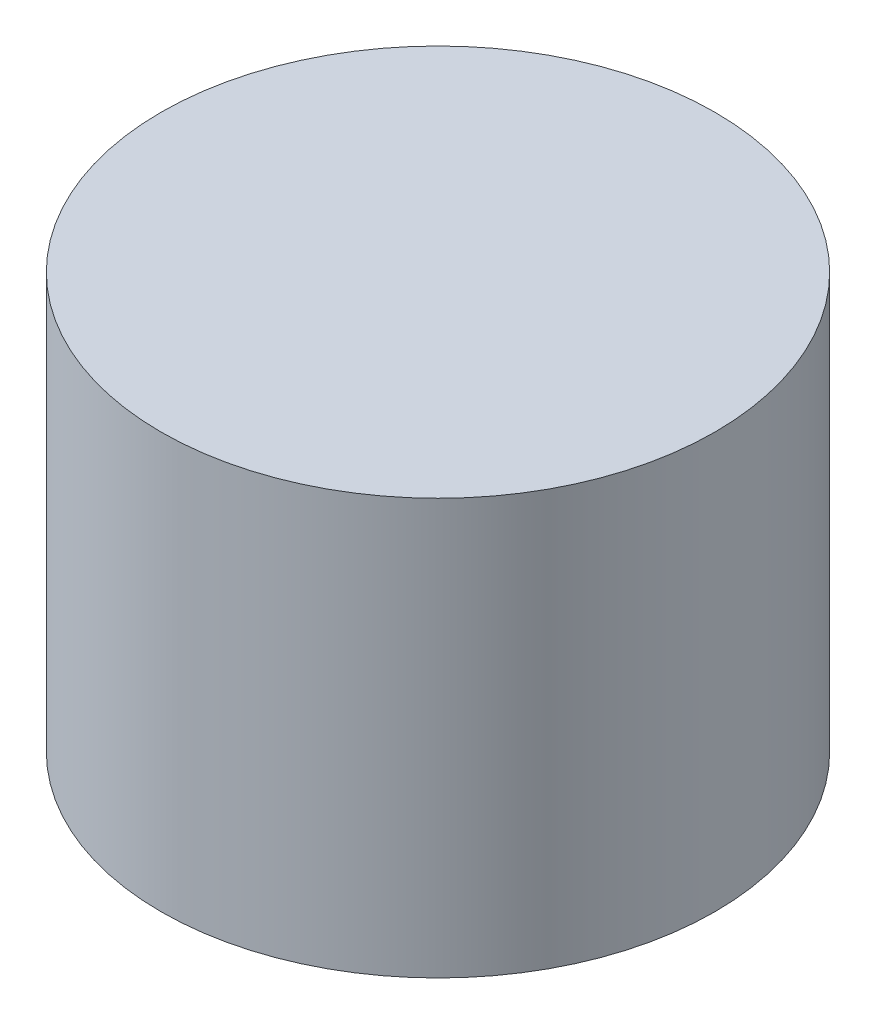
ISO-10303-21;
HEADER;
FILE_DESCRIPTION(('STEP AP214'),'2;1');
FILE_NAME('part.step','',(''),(''),'','','');
FILE_SCHEMA(('AUTOMOTIVE_DESIGN { 1 0 10303 214 1 1 1 1 }'));
ENDSEC;
DATA;
#1=APPLICATION_CONTEXT('core data for automotive mechanical design processes');
#2=APPLICATION_PROTOCOL_DEFINITION('international standard','automotive_design',2000,#1);
#3=PRODUCT_CONTEXT('',#1,'mechanical');
#4=PRODUCT('Part','Part','',(#3));
#5=PRODUCT_RELATED_PRODUCT_CATEGORY('part','',(#4));
#6=PRODUCT_DEFINITION_FORMATION('','',#4);
#7=PRODUCT_DEFINITION_CONTEXT('part definition',#1,'design');
#8=PRODUCT_DEFINITION('design','',#6,#7);
#9=PRODUCT_DEFINITION_SHAPE('','',#8);
#10=(LENGTH_UNIT() NAMED_UNIT(*) SI_UNIT(.MILLI.,.METRE.));
#11=(NAMED_UNIT(*) PLANE_ANGLE_UNIT() SI_UNIT($,.RADIAN.));
#12=(NAMED_UNIT(*) SI_UNIT($,.STERADIAN.) SOLID_ANGLE_UNIT());
#13=UNCERTAINTY_MEASURE_WITH_UNIT(LENGTH_MEASURE(1.E-05),#10,'distance_accuracy_value','');
#14=(GEOMETRIC_REPRESENTATION_CONTEXT(3) GLOBAL_UNCERTAINTY_ASSIGNED_CONTEXT((#13)) GLOBAL_UNIT_ASSIGNED_CONTEXT((#10,
#11,#12)) REPRESENTATION_CONTEXT('',''));
#15=CARTESIAN_POINT('',(0.,0.,0.));
#16=DIRECTION('',(0.,0.,1.));
#17=DIRECTION('',(1.,0.,0.));
#18=AXIS2_PLACEMENT_3D('',#15,#16,#17);
#19=CARTESIAN_POINT('',(-36.4452566736426,12.,-29.8669634566159));
#20=DIRECTION('',(0.,-1.,0.));
#21=DIRECTION('',(0.,0.,-1.));
#22=AXIS2_PLACEMENT_3D('',#19,#20,#21);
#23=CYLINDRICAL_SURFACE('',#22,8.);
#24=CARTESIAN_POINT('',(-36.4452566736426,12.,-29.8669634566159));
#25=DIRECTION('',(0.,1.,0.));
#26=DIRECTION('',(0.,0.,1.));
#27=AXIS2_PLACEMENT_3D('',#24,#25,#26);
#28=CIRCLE('',#27,8.);
#29=CARTESIAN_POINT('',(-36.4452566736426,12.,-21.8669634566159));
#30=VERTEX_POINT('',#29);
#31=EDGE_CURVE('E10',#30,#30,#28,.T.);
#32=ORIENTED_EDGE('',*,*,#31,.F.);
#33=EDGE_LOOP('',(#32));
#34=FACE_BOUND('',#33,.T.);
#35=CARTESIAN_POINT('',(-36.4452566736426,0.,-29.8669634566159));
#36=DIRECTION('',(0.,1.,0.));
#37=DIRECTION('',(0.,0.,1.));
#38=AXIS2_PLACEMENT_3D('',#35,#36,#37);
#39=CIRCLE('',#38,8.);
#40=CARTESIAN_POINT('',(-36.4452566736426,0.,-21.8669634566159));
#41=VERTEX_POINT('',#40);
#42=EDGE_CURVE('E40',#41,#41,#39,.T.);
#43=ORIENTED_EDGE('',*,*,#42,.T.);
#44=EDGE_LOOP('',(#43));
#45=FACE_BOUND('',#44,.T.);
#46=ADVANCED_FACE('F37',(#34,#45),#23,.T.);
#47=CARTESIAN_POINT('',(-36.4452566736426,12.,-29.8669634566159));
#48=DIRECTION('',(0.,1.,0.));
#49=DIRECTION('',(0.,0.,1.));
#50=AXIS2_PLACEMENT_3D('',#47,#48,#49);
#51=PLANE('',#50);
#52=ORIENTED_EDGE('',*,*,#31,.T.);
#53=EDGE_LOOP('',(#52));
#54=FACE_BOUND('',#53,.T.);
#55=ADVANCED_FACE('F54',(#54),#51,.T.);
#56=CARTESIAN_POINT('',(-36.4452566736426,0.,-29.8669634566159));
#57=DIRECTION('',(0.,1.,0.));
#58=DIRECTION('',(0.,0.,1.));
#59=AXIS2_PLACEMENT_3D('',#56,#57,#58);
#60=PLANE('',#59);
#61=ORIENTED_EDGE('',*,*,#42,.F.);
#62=EDGE_LOOP('',(#61));
#63=FACE_BOUND('',#62,.T.);
#64=ADVANCED_FACE('F52',(#63),#60,.F.);
#65=CLOSED_SHELL('',(#46,#55,#64));
#66=MANIFOLD_SOLID_BREP('B2',#65);
#67=ADVANCED_BREP_SHAPE_REPRESENTATION('',(#18,#66),#14);
#68=SHAPE_DEFINITION_REPRESENTATION(#9,#67);
ENDSEC;
END-ISO-10303-21;
